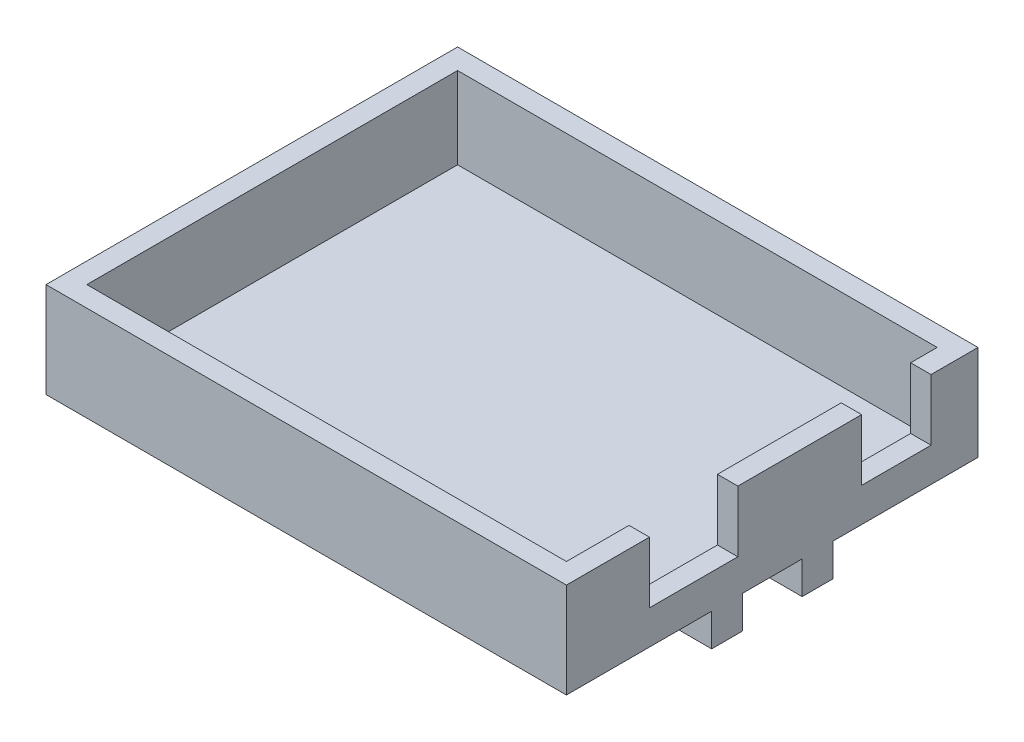
ISO-10303-21;
HEADER;
FILE_DESCRIPTION(('STEP AP214'),'2;1');
FILE_NAME('part.step','',(''),(''),'','','');
FILE_SCHEMA(('AUTOMOTIVE_DESIGN { 1 0 10303 214 1 1 1 1 }'));
ENDSEC;
DATA;
#1=APPLICATION_CONTEXT('core data for automotive mechanical design processes');
#2=APPLICATION_PROTOCOL_DEFINITION('international standard','automotive_design',2000,#1);
#3=PRODUCT_CONTEXT('',#1,'mechanical');
#4=PRODUCT('Part','Part','',(#3));
#5=PRODUCT_RELATED_PRODUCT_CATEGORY('part','',(#4));
#6=PRODUCT_DEFINITION_FORMATION('','',#4);
#7=PRODUCT_DEFINITION_CONTEXT('part definition',#1,'design');
#8=PRODUCT_DEFINITION('design','',#6,#7);
#9=PRODUCT_DEFINITION_SHAPE('','',#8);
#10=(LENGTH_UNIT() NAMED_UNIT(*) SI_UNIT(.MILLI.,.METRE.));
#11=(NAMED_UNIT(*) PLANE_ANGLE_UNIT() SI_UNIT($,.RADIAN.));
#12=(NAMED_UNIT(*) SI_UNIT($,.STERADIAN.) SOLID_ANGLE_UNIT());
#13=UNCERTAINTY_MEASURE_WITH_UNIT(LENGTH_MEASURE(1.E-05),#10,'distance_accuracy_value','');
#14=(GEOMETRIC_REPRESENTATION_CONTEXT(3) GLOBAL_UNCERTAINTY_ASSIGNED_CONTEXT((#13)) GLOBAL_UNIT_ASSIGNED_CONTEXT((#10,
#11,#12)) REPRESENTATION_CONTEXT('',''));
#15=CARTESIAN_POINT('',(0.,0.,0.));
#16=DIRECTION('',(0.,0.,1.));
#17=DIRECTION('',(1.,0.,0.));
#18=AXIS2_PLACEMENT_3D('',#15,#16,#17);
#19=CARTESIAN_POINT('',(0.,0.,0.));
#20=DIRECTION('',(0.,-1.,0.));
#21=DIRECTION('',(0.,0.,-1.));
#22=AXIS2_PLACEMENT_3D('',#19,#20,#21);
#23=PLANE('',#22);
#24=DIRECTION('',(-1.,0.,0.));
#25=VECTOR('',#24,1.);
#26=CARTESIAN_POINT('',(-38.25,0.,-8.9));
#27=LINE('',#26,#25);
#28=CARTESIAN_POINT('',(38.25,0.,-8.90000000000001));
#29=VERTEX_POINT('',#28);
#30=CARTESIAN_POINT('',(-38.25,0.,-8.90000000000001));
#31=VERTEX_POINT('',#30);
#32=EDGE_CURVE('E231',#29,#31,#27,.T.);
#33=ORIENTED_EDGE('',*,*,#32,.T.);
#34=DIRECTION('',(0.,0.,1.));
#35=VECTOR('',#34,1.);
#36=CARTESIAN_POINT('',(-38.25,0.,30.25));
#37=LINE('',#36,#35);
#38=CARTESIAN_POINT('',(-38.25,0.,-30.25));
#39=VERTEX_POINT('',#38);
#40=EDGE_CURVE('E208',#39,#31,#37,.T.);
#41=ORIENTED_EDGE('',*,*,#40,.F.);
#42=DIRECTION('',(-1.,0.,0.));
#43=VECTOR('',#42,1.);
#44=CARTESIAN_POINT('',(-38.25,0.,-30.25));
#45=LINE('',#44,#43);
#46=CARTESIAN_POINT('',(38.25,0.,-30.25));
#47=VERTEX_POINT('',#46);
#48=EDGE_CURVE('E363',#47,#39,#45,.T.);
#49=ORIENTED_EDGE('',*,*,#48,.F.);
#50=DIRECTION('',(0.,0.,-1.));
#51=VECTOR('',#50,1.);
#52=CARTESIAN_POINT('',(38.25,0.,30.25));
#53=LINE('',#52,#51);
#54=EDGE_CURVE('E53',#29,#47,#53,.T.);
#55=ORIENTED_EDGE('',*,*,#54,.F.);
#56=EDGE_LOOP('',(#33,#41,#49,#55));
#57=FACE_BOUND('',#56,.T.);
#58=ADVANCED_FACE('F38',(#57),#23,.T.);
#59=DIRECTION('',(-1.,0.,0.));
#60=VECTOR('',#59,1.);
#61=CARTESIAN_POINT('',(-38.25,0.,8.9));
#62=LINE('',#61,#60);
#63=CARTESIAN_POINT('',(38.25,0.,8.9));
#64=VERTEX_POINT('',#63);
#65=CARTESIAN_POINT('',(-38.25,0.,8.9));
#66=VERTEX_POINT('',#65);
#67=EDGE_CURVE('E243',#64,#66,#62,.T.);
#68=ORIENTED_EDGE('',*,*,#67,.F.);
#69=CARTESIAN_POINT('',(38.25,0.,30.25));
#70=VERTEX_POINT('',#69);
#71=EDGE_CURVE('E360',#70,#64,#53,.T.);
#72=ORIENTED_EDGE('',*,*,#71,.F.);
#73=DIRECTION('',(1.,0.,0.));
#74=VECTOR('',#73,1.);
#75=CARTESIAN_POINT('',(-38.25,0.,30.25));
#76=LINE('',#75,#74);
#77=CARTESIAN_POINT('',(-38.25,0.,30.25));
#78=VERTEX_POINT('',#77);
#79=EDGE_CURVE('E368',#78,#70,#76,.T.);
#80=ORIENTED_EDGE('',*,*,#79,.F.);
#81=EDGE_CURVE('E366',#66,#78,#37,.T.);
#82=ORIENTED_EDGE('',*,*,#81,.F.);
#83=EDGE_LOOP('',(#68,#72,#80,#82));
#84=FACE_BOUND('',#83,.T.);
#85=ADVANCED_FACE('F405',(#84),#23,.T.);
#86=CARTESIAN_POINT('',(0.,14.,0.));
#87=DIRECTION('',(0.,-1.,0.));
#88=DIRECTION('',(0.,0.,-1.));
#89=AXIS2_PLACEMENT_3D('',#86,#87,#88);
#90=PLANE('',#89);
#91=DIRECTION('',(0.,0.,-1.));
#92=VECTOR('',#91,1.);
#93=CARTESIAN_POINT('',(35.25,14.,-27.25));
#94=LINE('',#93,#92);
#95=CARTESIAN_POINT('',(35.25,14.,5.05));
#96=VERTEX_POINT('',#95);
#97=CARTESIAN_POINT('',(35.25,14.,-13.15));
#98=VERTEX_POINT('',#97);
#99=EDGE_CURVE('E332',#96,#98,#94,.T.);
#100=ORIENTED_EDGE('',*,*,#99,.F.);
#101=DIRECTION('',(1.,0.,0.));
#102=VECTOR('',#101,1.);
#103=CARTESIAN_POINT('',(-38.251,14.,5.05));
#104=LINE('',#103,#102);
#105=CARTESIAN_POINT('',(38.25,14.,5.05));
#106=VERTEX_POINT('',#105);
#107=EDGE_CURVE('E281',#96,#106,#104,.T.);
#108=ORIENTED_EDGE('',*,*,#107,.T.);
#109=DIRECTION('',(0.,0.,-1.));
#110=VECTOR('',#109,1.);
#111=CARTESIAN_POINT('',(38.25,14.,30.25));
#112=LINE('',#111,#110);
#113=CARTESIAN_POINT('',(38.25,14.,-13.15));
#114=VERTEX_POINT('',#113);
#115=EDGE_CURVE('E352',#106,#114,#112,.T.);
#116=ORIENTED_EDGE('',*,*,#115,.T.);
#117=DIRECTION('',(1.,0.,0.));
#118=VECTOR('',#117,1.);
#119=CARTESIAN_POINT('',(-38.251,14.,-13.15));
#120=LINE('',#119,#118);
#121=EDGE_CURVE('E296',#98,#114,#120,.T.);
#122=ORIENTED_EDGE('',*,*,#121,.F.);
#123=EDGE_LOOP('',(#100,#108,#116,#122));
#124=FACE_BOUND('',#123,.T.);
#125=ADVANCED_FACE('F421',(#124),#90,.F.);
#126=CARTESIAN_POINT('',(38.25,14.,30.25));
#127=DIRECTION('',(-1.,0.,0.));
#128=DIRECTION('',(0.,0.,1.));
#129=AXIS2_PLACEMENT_3D('',#126,#127,#128);
#130=PLANE('',#129);
#131=ORIENTED_EDGE('',*,*,#115,.F.);
#132=DIRECTION('',(0.,1.,0.));
#133=VECTOR('',#132,1.);
#134=CARTESIAN_POINT('',(38.25,14.,5.05));
#135=LINE('',#134,#133);
#136=CARTESIAN_POINT('',(38.25,5.,5.05));
#137=VERTEX_POINT('',#136);
#138=EDGE_CURVE('E278',#137,#106,#135,.T.);
#139=ORIENTED_EDGE('',*,*,#138,.F.);
#140=DIRECTION('',(0.,0.,-1.));
#141=VECTOR('',#140,1.);
#142=CARTESIAN_POINT('',(38.25,5.,18.05));
#143=LINE('',#142,#141);
#144=CARTESIAN_POINT('',(38.25,5.,18.05));
#145=VERTEX_POINT('',#144);
#146=EDGE_CURVE('E275',#145,#137,#143,.T.);
#147=ORIENTED_EDGE('',*,*,#146,.F.);
#148=DIRECTION('',(0.,-1.,0.));
#149=VECTOR('',#148,1.);
#150=CARTESIAN_POINT('',(38.25,14.,18.05));
#151=LINE('',#150,#149);
#152=CARTESIAN_POINT('',(38.25,14.,18.05));
#153=VERTEX_POINT('',#152);
#154=EDGE_CURVE('E272',#153,#145,#151,.T.);
#155=ORIENTED_EDGE('',*,*,#154,.F.);
#156=CARTESIAN_POINT('',(38.25,14.,30.25));
#157=VERTEX_POINT('',#156);
#158=EDGE_CURVE('E348',#157,#153,#112,.T.);
#159=ORIENTED_EDGE('',*,*,#158,.F.);
#160=DIRECTION('',(0.,-1.,0.));
#161=VECTOR('',#160,1.);
#162=CARTESIAN_POINT('',(38.25,14.,30.25));
#163=LINE('',#162,#161);
#164=EDGE_CURVE('E359',#157,#70,#163,.T.);
#165=ORIENTED_EDGE('',*,*,#164,.T.);
#166=ORIENTED_EDGE('',*,*,#71,.T.);
#167=DIRECTION('',(0.,1.,0.));
#168=VECTOR('',#167,1.);
#169=CARTESIAN_POINT('',(38.25,-4.8,8.9));
#170=LINE('',#169,#168);
#171=CARTESIAN_POINT('',(38.25,-4.8,8.9));
#172=VERTEX_POINT('',#171);
#173=EDGE_CURVE('E256',#172,#64,#170,.T.);
#174=ORIENTED_EDGE('',*,*,#173,.F.);
#175=DIRECTION('',(0.,0.,1.));
#176=VECTOR('',#175,1.);
#177=CARTESIAN_POINT('',(38.25,-4.8,4.4));
#178=LINE('',#177,#176);
#179=CARTESIAN_POINT('',(38.25,-4.8,4.4));
#180=VERTEX_POINT('',#179);
#181=EDGE_CURVE('E245',#180,#172,#178,.T.);
#182=ORIENTED_EDGE('',*,*,#181,.F.);
#183=DIRECTION('',(0.,1.,0.));
#184=VECTOR('',#183,1.);
#185=CARTESIAN_POINT('',(38.25,-4.8,4.4));
#186=LINE('',#185,#184);
#187=CARTESIAN_POINT('',(38.25,0.,4.4));
#188=VERTEX_POINT('',#187);
#189=EDGE_CURVE('E259',#180,#188,#186,.T.);
#190=ORIENTED_EDGE('',*,*,#189,.T.);
#191=CARTESIAN_POINT('',(38.25,0.,-4.4));
#192=VERTEX_POINT('',#191);
#193=EDGE_CURVE('E364',#188,#192,#53,.T.);
#194=ORIENTED_EDGE('',*,*,#193,.T.);
#195=DIRECTION('',(0.,1.,0.));
#196=VECTOR('',#195,1.);
#197=CARTESIAN_POINT('',(38.25,-4.8,-4.4));
#198=LINE('',#197,#196);
#199=CARTESIAN_POINT('',(38.25,-4.8,-4.4));
#200=VERTEX_POINT('',#199);
#201=EDGE_CURVE('E235',#200,#192,#198,.T.);
#202=ORIENTED_EDGE('',*,*,#201,.F.);
#203=DIRECTION('',(0.,0.,-1.));
#204=VECTOR('',#203,1.);
#205=CARTESIAN_POINT('',(38.25,-4.8,-4.4));
#206=LINE('',#205,#204);
#207=CARTESIAN_POINT('',(38.25,-4.8,-8.9));
#208=VERTEX_POINT('',#207);
#209=EDGE_CURVE('E225',#200,#208,#206,.T.);
#210=ORIENTED_EDGE('',*,*,#209,.T.);
#211=DIRECTION('',(0.,1.,0.));
#212=VECTOR('',#211,1.);
#213=CARTESIAN_POINT('',(38.25,-4.8,-8.9));
#214=LINE('',#213,#212);
#215=EDGE_CURVE('E213',#208,#29,#214,.T.);
#216=ORIENTED_EDGE('',*,*,#215,.T.);
#217=ORIENTED_EDGE('',*,*,#54,.T.);
#218=DIRECTION('',(0.,-1.,0.));
#219=VECTOR('',#218,1.);
#220=CARTESIAN_POINT('',(38.25,14.,-30.25));
#221=LINE('',#220,#219);
#222=CARTESIAN_POINT('',(38.25,14.,-30.25));
#223=VERTEX_POINT('',#222);
#224=EDGE_CURVE('E11',#223,#47,#221,.T.);
#225=ORIENTED_EDGE('',*,*,#224,.F.);
#226=CARTESIAN_POINT('',(38.25,14.,-23.35));
#227=VERTEX_POINT('',#226);
#228=EDGE_CURVE('E353',#227,#223,#112,.T.);
#229=ORIENTED_EDGE('',*,*,#228,.F.);
#230=DIRECTION('',(0.,1.,0.));
#231=VECTOR('',#230,1.);
#232=CARTESIAN_POINT('',(38.25,14.,-23.35));
#233=LINE('',#232,#231);
#234=CARTESIAN_POINT('',(38.25,5.,-23.35));
#235=VERTEX_POINT('',#234);
#236=EDGE_CURVE('E306',#235,#227,#233,.T.);
#237=ORIENTED_EDGE('',*,*,#236,.F.);
#238=DIRECTION('',(0.,0.,-1.));
#239=VECTOR('',#238,1.);
#240=CARTESIAN_POINT('',(38.25,5.,-23.35));
#241=LINE('',#240,#239);
#242=CARTESIAN_POINT('',(38.25,5.,-13.15));
#243=VERTEX_POINT('',#242);
#244=EDGE_CURVE('E295',#243,#235,#241,.T.);
#245=ORIENTED_EDGE('',*,*,#244,.F.);
#246=DIRECTION('',(0.,-1.,0.));
#247=VECTOR('',#246,1.);
#248=CARTESIAN_POINT('',(38.25,14.,-13.15));
#249=LINE('',#248,#247);
#250=EDGE_CURVE('E303',#114,#243,#249,.T.);
#251=ORIENTED_EDGE('',*,*,#250,.F.);
#252=EDGE_LOOP('',(#131,#139,#147,#155,#159,#165,#166,#174,#182,#190,#194,#202,#210,#216,#217,
#225,#229,#237,#245,#251));
#253=FACE_BOUND('',#252,.T.);
#254=ADVANCED_FACE('F40',(#253),#130,.F.);
#255=CARTESIAN_POINT('',(-38.25,14.,-30.25));
#256=DIRECTION('',(0.,0.,1.));
#257=DIRECTION('',(1.,0.,0.));
#258=AXIS2_PLACEMENT_3D('',#255,#256,#257);
#259=PLANE('',#258);
#260=ORIENTED_EDGE('',*,*,#48,.T.);
#261=DIRECTION('',(0.,-1.,0.));
#262=VECTOR('',#261,1.);
#263=CARTESIAN_POINT('',(-38.25,14.,-30.25));
#264=LINE('',#263,#262);
#265=CARTESIAN_POINT('',(-38.25,14.,-30.25));
#266=VERTEX_POINT('',#265);
#267=EDGE_CURVE('E46',#266,#39,#264,.T.);
#268=ORIENTED_EDGE('',*,*,#267,.F.);
#269=DIRECTION('',(-1.,0.,0.));
#270=VECTOR('',#269,1.);
#271=CARTESIAN_POINT('',(-38.25,14.,-30.25));
#272=LINE('',#271,#270);
#273=EDGE_CURVE('E351',#223,#266,#272,.T.);
#274=ORIENTED_EDGE('',*,*,#273,.F.);
#275=ORIENTED_EDGE('',*,*,#224,.T.);
#276=EDGE_LOOP('',(#260,#268,#274,#275));
#277=FACE_BOUND('',#276,.T.);
#278=ADVANCED_FACE('F381',(#277),#259,.F.);
#279=CARTESIAN_POINT('',(-38.25,14.,30.25));
#280=DIRECTION('',(1.,0.,0.));
#281=DIRECTION('',(0.,0.,-1.));
#282=AXIS2_PLACEMENT_3D('',#279,#280,#281);
#283=PLANE('',#282);
#284=ORIENTED_EDGE('',*,*,#40,.T.);
#285=DIRECTION('',(0.,1.,0.));
#286=VECTOR('',#285,1.);
#287=CARTESIAN_POINT('',(-38.25,-4.8,-8.9));
#288=LINE('',#287,#286);
#289=CARTESIAN_POINT('',(-38.25,-4.8,-8.9));
#290=VERTEX_POINT('',#289);
#291=EDGE_CURVE('E200',#290,#31,#288,.T.);
#292=ORIENTED_EDGE('',*,*,#291,.F.);
#293=DIRECTION('',(0.,0.,1.));
#294=VECTOR('',#293,1.);
#295=CARTESIAN_POINT('',(-38.25,-4.8,-4.4));
#296=LINE('',#295,#294);
#297=CARTESIAN_POINT('',(-38.25,-4.8,-4.4));
#298=VERTEX_POINT('',#297);
#299=EDGE_CURVE('E204',#290,#298,#296,.T.);
#300=ORIENTED_EDGE('',*,*,#299,.T.);
#301=DIRECTION('',(0.,1.,0.));
#302=VECTOR('',#301,1.);
#303=CARTESIAN_POINT('',(-38.25,-4.8,-4.4));
#304=LINE('',#303,#302);
#305=CARTESIAN_POINT('',(-38.25,0.,-4.4));
#306=VERTEX_POINT('',#305);
#307=EDGE_CURVE('E230',#298,#306,#304,.T.);
#308=ORIENTED_EDGE('',*,*,#307,.T.);
#309=CARTESIAN_POINT('',(-38.25,0.,4.4));
#310=VERTEX_POINT('',#309);
#311=EDGE_CURVE('E369',#306,#310,#37,.T.);
#312=ORIENTED_EDGE('',*,*,#311,.T.);
#313=DIRECTION('',(0.,1.,0.));
#314=VECTOR('',#313,1.);
#315=CARTESIAN_POINT('',(-38.25,-4.8,4.4));
#316=LINE('',#315,#314);
#317=CARTESIAN_POINT('',(-38.25,-4.8,4.4));
#318=VERTEX_POINT('',#317);
#319=EDGE_CURVE('E262',#318,#310,#316,.T.);
#320=ORIENTED_EDGE('',*,*,#319,.F.);
#321=DIRECTION('',(0.,0.,-1.));
#322=VECTOR('',#321,1.);
#323=CARTESIAN_POINT('',(-38.25,-4.8,4.4));
#324=LINE('',#323,#322);
#325=CARTESIAN_POINT('',(-38.25,-4.8,8.9));
#326=VERTEX_POINT('',#325);
#327=EDGE_CURVE('E239',#326,#318,#324,.T.);
#328=ORIENTED_EDGE('',*,*,#327,.F.);
#329=DIRECTION('',(0.,1.,0.));
#330=VECTOR('',#329,1.);
#331=CARTESIAN_POINT('',(-38.25,-4.8,8.9));
#332=LINE('',#331,#330);
#333=EDGE_CURVE('E249',#326,#66,#332,.T.);
#334=ORIENTED_EDGE('',*,*,#333,.T.);
#335=ORIENTED_EDGE('',*,*,#81,.T.);
#336=DIRECTION('',(0.,-1.,0.));
#337=VECTOR('',#336,1.);
#338=CARTESIAN_POINT('',(-38.25,14.,30.25));
#339=LINE('',#338,#337);
#340=CARTESIAN_POINT('',(-38.25,14.,30.25));
#341=VERTEX_POINT('',#340);
#342=EDGE_CURVE('E373',#341,#78,#339,.T.);
#343=ORIENTED_EDGE('',*,*,#342,.F.);
#344=DIRECTION('',(0.,0.,1.));
#345=VECTOR('',#344,1.);
#346=CARTESIAN_POINT('',(-38.25,14.,30.25));
#347=LINE('',#346,#345);
#348=EDGE_CURVE('E355',#266,#341,#347,.T.);
#349=ORIENTED_EDGE('',*,*,#348,.F.);
#350=ORIENTED_EDGE('',*,*,#267,.T.);
#351=EDGE_LOOP('',(#284,#292,#300,#308,#312,#320,#328,#334,#335,#343,#349,#350));
#352=FACE_BOUND('',#351,.T.);
#353=ADVANCED_FACE('F202',(#352),#283,.F.);
#354=CARTESIAN_POINT('',(-38.25,14.,30.25));
#355=DIRECTION('',(0.,0.,-1.));
#356=DIRECTION('',(-1.,0.,0.));
#357=AXIS2_PLACEMENT_3D('',#354,#355,#356);
#358=PLANE('',#357);
#359=ORIENTED_EDGE('',*,*,#79,.T.);
#360=ORIENTED_EDGE('',*,*,#164,.F.);
#361=DIRECTION('',(1.,0.,0.));
#362=VECTOR('',#361,1.);
#363=CARTESIAN_POINT('',(-38.25,14.,30.25));
#364=LINE('',#363,#362);
#365=EDGE_CURVE('E357',#341,#157,#364,.T.);
#366=ORIENTED_EDGE('',*,*,#365,.F.);
#367=ORIENTED_EDGE('',*,*,#342,.T.);
#368=EDGE_LOOP('',(#359,#360,#366,#367));
#369=FACE_BOUND('',#368,.T.);
#370=ADVANCED_FACE('F412',(#369),#358,.F.);
#371=ORIENTED_EDGE('',*,*,#158,.T.);
#372=DIRECTION('',(1.,0.,0.));
#373=VECTOR('',#372,1.);
#374=CARTESIAN_POINT('',(-38.251,14.,18.05));
#375=LINE('',#374,#373);
#376=CARTESIAN_POINT('',(35.25,14.,18.05));
#377=VERTEX_POINT('',#376);
#378=EDGE_CURVE('E280',#377,#153,#375,.T.);
#379=ORIENTED_EDGE('',*,*,#378,.F.);
#380=CARTESIAN_POINT('',(35.25,14.,27.25));
#381=VERTEX_POINT('',#380);
#382=EDGE_CURVE('E328',#381,#377,#94,.T.);
#383=ORIENTED_EDGE('',*,*,#382,.F.);
#384=DIRECTION('',(1.,0.,0.));
#385=VECTOR('',#384,1.);
#386=CARTESIAN_POINT('',(-35.25,14.,27.25));
#387=LINE('',#386,#385);
#388=CARTESIAN_POINT('',(-35.25,14.,27.25));
#389=VERTEX_POINT('',#388);
#390=EDGE_CURVE('E318',#389,#381,#387,.T.);
#391=ORIENTED_EDGE('',*,*,#390,.F.);
#392=DIRECTION('',(0.,0.,1.));
#393=VECTOR('',#392,1.);
#394=CARTESIAN_POINT('',(-35.25,14.,-27.25));
#395=LINE('',#394,#393);
#396=CARTESIAN_POINT('',(-35.25,14.,-27.25));
#397=VERTEX_POINT('',#396);
#398=EDGE_CURVE('E335',#397,#389,#395,.T.);
#399=ORIENTED_EDGE('',*,*,#398,.F.);
#400=DIRECTION('',(-1.,0.,0.));
#401=VECTOR('',#400,1.);
#402=CARTESIAN_POINT('',(-35.25,14.,-27.25));
#403=LINE('',#402,#401);
#404=CARTESIAN_POINT('',(35.25,14.,-27.25));
#405=VERTEX_POINT('',#404);
#406=EDGE_CURVE('E331',#405,#397,#403,.T.);
#407=ORIENTED_EDGE('',*,*,#406,.F.);
#408=CARTESIAN_POINT('',(35.25,14.,-23.35));
#409=VERTEX_POINT('',#408);
#410=EDGE_CURVE('E291',#409,#405,#94,.T.);
#411=ORIENTED_EDGE('',*,*,#410,.F.);
#412=DIRECTION('',(1.,0.,0.));
#413=VECTOR('',#412,1.);
#414=CARTESIAN_POINT('',(-38.251,14.,-23.35));
#415=LINE('',#414,#413);
#416=EDGE_CURVE('E292',#409,#227,#415,.T.);
#417=ORIENTED_EDGE('',*,*,#416,.T.);
#418=ORIENTED_EDGE('',*,*,#228,.T.);
#419=ORIENTED_EDGE('',*,*,#273,.T.);
#420=ORIENTED_EDGE('',*,*,#348,.T.);
#421=ORIENTED_EDGE('',*,*,#365,.T.);
#422=EDGE_LOOP('',(#371,#379,#383,#391,#399,#407,#411,#417,#418,#419,#420,#421));
#423=FACE_BOUND('',#422,.T.);
#424=ADVANCED_FACE('F414',(#423),#90,.F.);
#425=DIRECTION('',(1.,0.,0.));
#426=VECTOR('',#425,1.);
#427=CARTESIAN_POINT('',(-38.25,0.,-4.4));
#428=LINE('',#427,#426);
#429=EDGE_CURVE('E61',#306,#192,#428,.T.);
#430=ORIENTED_EDGE('',*,*,#429,.T.);
#431=ORIENTED_EDGE('',*,*,#193,.F.);
#432=DIRECTION('',(1.,0.,0.));
#433=VECTOR('',#432,1.);
#434=CARTESIAN_POINT('',(-38.25,0.,4.4));
#435=LINE('',#434,#433);
#436=EDGE_CURVE('E212',#310,#188,#435,.T.);
#437=ORIENTED_EDGE('',*,*,#436,.F.);
#438=ORIENTED_EDGE('',*,*,#311,.F.);
#439=EDGE_LOOP('',(#430,#431,#437,#438));
#440=FACE_BOUND('',#439,.T.);
#441=ADVANCED_FACE('F393',(#440),#23,.T.);
#442=CARTESIAN_POINT('',(35.25,2.,-27.25));
#443=DIRECTION('',(1.,0.,0.));
#444=DIRECTION('',(0.,0.,-1.));
#445=AXIS2_PLACEMENT_3D('',#442,#443,#444);
#446=PLANE('',#445);
#447=DIRECTION('',(0.,0.,1.));
#448=VECTOR('',#447,1.);
#449=CARTESIAN_POINT('',(35.25,5.,18.05));
#450=LINE('',#449,#448);
#451=CARTESIAN_POINT('',(35.25,5.,5.05));
#452=VERTEX_POINT('',#451);
#453=CARTESIAN_POINT('',(35.25,5.,18.05));
#454=VERTEX_POINT('',#453);
#455=EDGE_CURVE('E266',#452,#454,#450,.T.);
#456=ORIENTED_EDGE('',*,*,#455,.F.);
#457=DIRECTION('',(0.,-1.,0.));
#458=VECTOR('',#457,1.);
#459=CARTESIAN_POINT('',(35.25,14.,5.05));
#460=LINE('',#459,#458);
#461=EDGE_CURVE('E268',#96,#452,#460,.T.);
#462=ORIENTED_EDGE('',*,*,#461,.F.);
#463=ORIENTED_EDGE('',*,*,#99,.T.);
#464=DIRECTION('',(0.,1.,0.));
#465=VECTOR('',#464,1.);
#466=CARTESIAN_POINT('',(35.25,14.,-13.15));
#467=LINE('',#466,#465);
#468=CARTESIAN_POINT('',(35.25,5.,-13.15));
#469=VERTEX_POINT('',#468);
#470=EDGE_CURVE('E269',#469,#98,#467,.T.);
#471=ORIENTED_EDGE('',*,*,#470,.F.);
#472=DIRECTION('',(0.,0.,1.));
#473=VECTOR('',#472,1.);
#474=CARTESIAN_POINT('',(35.25,5.,-23.35));
#475=LINE('',#474,#473);
#476=CARTESIAN_POINT('',(35.25,5.,-23.35));
#477=VERTEX_POINT('',#476);
#478=EDGE_CURVE('E311',#477,#469,#475,.T.);
#479=ORIENTED_EDGE('',*,*,#478,.F.);
#480=DIRECTION('',(0.,-1.,0.));
#481=VECTOR('',#480,1.);
#482=CARTESIAN_POINT('',(35.25,14.,-23.35));
#483=LINE('',#482,#481);
#484=EDGE_CURVE('E308',#409,#477,#483,.T.);
#485=ORIENTED_EDGE('',*,*,#484,.F.);
#486=ORIENTED_EDGE('',*,*,#410,.T.);
#487=DIRECTION('',(0.,1.,0.));
#488=VECTOR('',#487,1.);
#489=CARTESIAN_POINT('',(35.25,2.,-27.25));
#490=LINE('',#489,#488);
#491=CARTESIAN_POINT('',(35.25,2.,-27.25));
#492=VERTEX_POINT('',#491);
#493=EDGE_CURVE('E327',#492,#405,#490,.T.);
#494=ORIENTED_EDGE('',*,*,#493,.F.);
#495=DIRECTION('',(0.,0.,-1.));
#496=VECTOR('',#495,1.);
#497=CARTESIAN_POINT('',(35.25,2.,-27.25));
#498=LINE('',#497,#496);
#499=CARTESIAN_POINT('',(35.25,2.,27.25));
#500=VERTEX_POINT('',#499);
#501=EDGE_CURVE('E314',#500,#492,#498,.T.);
#502=ORIENTED_EDGE('',*,*,#501,.F.);
#503=DIRECTION('',(0.,1.,0.));
#504=VECTOR('',#503,1.);
#505=CARTESIAN_POINT('',(35.25,2.,27.25));
#506=LINE('',#505,#504);
#507=EDGE_CURVE('E340',#500,#381,#506,.T.);
#508=ORIENTED_EDGE('',*,*,#507,.T.);
#509=ORIENTED_EDGE('',*,*,#382,.T.);
#510=DIRECTION('',(0.,1.,0.));
#511=VECTOR('',#510,1.);
#512=CARTESIAN_POINT('',(35.25,14.,18.05));
#513=LINE('',#512,#511);
#514=EDGE_CURVE('E284',#454,#377,#513,.T.);
#515=ORIENTED_EDGE('',*,*,#514,.F.);
#516=EDGE_LOOP('',(#456,#462,#463,#471,#479,#485,#486,#494,#502,#508,#509,#515));
#517=FACE_BOUND('',#516,.T.);
#518=ADVANCED_FACE('F434',(#517),#446,.F.);
#519=CARTESIAN_POINT('',(-35.25,2.,27.25));
#520=DIRECTION('',(0.,0.,1.));
#521=DIRECTION('',(1.,0.,0.));
#522=AXIS2_PLACEMENT_3D('',#519,#520,#521);
#523=PLANE('',#522);
#524=ORIENTED_EDGE('',*,*,#390,.T.);
#525=ORIENTED_EDGE('',*,*,#507,.F.);
#526=DIRECTION('',(1.,0.,0.));
#527=VECTOR('',#526,1.);
#528=CARTESIAN_POINT('',(-35.25,2.,27.25));
#529=LINE('',#528,#527);
#530=CARTESIAN_POINT('',(-35.25,2.,27.25));
#531=VERTEX_POINT('',#530);
#532=EDGE_CURVE('E324',#531,#500,#529,.T.);
#533=ORIENTED_EDGE('',*,*,#532,.F.);
#534=DIRECTION('',(0.,1.,0.));
#535=VECTOR('',#534,1.);
#536=CARTESIAN_POINT('',(-35.25,2.,27.25));
#537=LINE('',#536,#535);
#538=EDGE_CURVE('E342',#531,#389,#537,.T.);
#539=ORIENTED_EDGE('',*,*,#538,.T.);
#540=EDGE_LOOP('',(#524,#525,#533,#539));
#541=FACE_BOUND('',#540,.T.);
#542=ADVANCED_FACE('F453',(#541),#523,.F.);
#543=CARTESIAN_POINT('',(-35.25,2.,-27.25));
#544=DIRECTION('',(-1.,0.,0.));
#545=DIRECTION('',(0.,0.,1.));
#546=AXIS2_PLACEMENT_3D('',#543,#544,#545);
#547=PLANE('',#546);
#548=ORIENTED_EDGE('',*,*,#398,.T.);
#549=ORIENTED_EDGE('',*,*,#538,.F.);
#550=DIRECTION('',(0.,0.,1.));
#551=VECTOR('',#550,1.);
#552=CARTESIAN_POINT('',(-35.25,2.,-27.25));
#553=LINE('',#552,#551);
#554=CARTESIAN_POINT('',(-35.25,2.,-27.25));
#555=VERTEX_POINT('',#554);
#556=EDGE_CURVE('E321',#555,#531,#553,.T.);
#557=ORIENTED_EDGE('',*,*,#556,.F.);
#558=DIRECTION('',(0.,1.,0.));
#559=VECTOR('',#558,1.);
#560=CARTESIAN_POINT('',(-35.25,2.,-27.25));
#561=LINE('',#560,#559);
#562=EDGE_CURVE('E344',#555,#397,#561,.T.);
#563=ORIENTED_EDGE('',*,*,#562,.T.);
#564=EDGE_LOOP('',(#548,#549,#557,#563));
#565=FACE_BOUND('',#564,.T.);
#566=ADVANCED_FACE('F446',(#565),#547,.F.);
#567=CARTESIAN_POINT('',(-35.25,2.,-27.25));
#568=DIRECTION('',(0.,0.,-1.));
#569=DIRECTION('',(-1.,0.,0.));
#570=AXIS2_PLACEMENT_3D('',#567,#568,#569);
#571=PLANE('',#570);
#572=ORIENTED_EDGE('',*,*,#406,.T.);
#573=ORIENTED_EDGE('',*,*,#562,.F.);
#574=DIRECTION('',(-1.,0.,0.));
#575=VECTOR('',#574,1.);
#576=CARTESIAN_POINT('',(-35.25,2.,-27.25));
#577=LINE('',#576,#575);
#578=EDGE_CURVE('E317',#492,#555,#577,.T.);
#579=ORIENTED_EDGE('',*,*,#578,.F.);
#580=ORIENTED_EDGE('',*,*,#493,.T.);
#581=EDGE_LOOP('',(#572,#573,#579,#580));
#582=FACE_BOUND('',#581,.T.);
#583=ADVANCED_FACE('F441',(#582),#571,.F.);
#584=CARTESIAN_POINT('',(0.,2.,0.));
#585=DIRECTION('',(0.,1.,0.));
#586=DIRECTION('',(0.,0.,1.));
#587=AXIS2_PLACEMENT_3D('',#584,#585,#586);
#588=PLANE('',#587);
#589=ORIENTED_EDGE('',*,*,#501,.T.);
#590=ORIENTED_EDGE('',*,*,#578,.T.);
#591=ORIENTED_EDGE('',*,*,#556,.T.);
#592=ORIENTED_EDGE('',*,*,#532,.T.);
#593=EDGE_LOOP('',(#589,#590,#591,#592));
#594=FACE_BOUND('',#593,.T.);
#595=ADVANCED_FACE('F450',(#594),#588,.T.);
#596=CARTESIAN_POINT('',(-38.251,14.,-23.35));
#597=DIRECTION('',(0.,0.,-1.));
#598=DIRECTION('',(-1.,0.,0.));
#599=AXIS2_PLACEMENT_3D('',#596,#597,#598);
#600=PLANE('',#599);
#601=ORIENTED_EDGE('',*,*,#484,.T.);
#602=DIRECTION('',(1.,0.,0.));
#603=VECTOR('',#602,1.);
#604=CARTESIAN_POINT('',(-38.251,5.,-23.35));
#605=LINE('',#604,#603);
#606=EDGE_CURVE('E265',#477,#235,#605,.T.);
#607=ORIENTED_EDGE('',*,*,#606,.T.);
#608=ORIENTED_EDGE('',*,*,#236,.T.);
#609=ORIENTED_EDGE('',*,*,#416,.F.);
#610=EDGE_LOOP('',(#601,#607,#608,#609));
#611=FACE_BOUND('',#610,.T.);
#612=ADVANCED_FACE('F545',(#611),#600,.F.);
#613=CARTESIAN_POINT('',(-38.251,5.,-23.35));
#614=DIRECTION('',(0.,-1.,0.));
#615=DIRECTION('',(0.,0.,-1.));
#616=AXIS2_PLACEMENT_3D('',#613,#614,#615);
#617=PLANE('',#616);
#618=ORIENTED_EDGE('',*,*,#478,.T.);
#619=DIRECTION('',(1.,0.,0.));
#620=VECTOR('',#619,1.);
#621=CARTESIAN_POINT('',(-38.251,5.,-13.15));
#622=LINE('',#621,#620);
#623=EDGE_CURVE('E298',#469,#243,#622,.T.);
#624=ORIENTED_EDGE('',*,*,#623,.T.);
#625=ORIENTED_EDGE('',*,*,#244,.T.);
#626=ORIENTED_EDGE('',*,*,#606,.F.);
#627=EDGE_LOOP('',(#618,#624,#625,#626));
#628=FACE_BOUND('',#627,.T.);
#629=ADVANCED_FACE('F468',(#628),#617,.F.);
#630=CARTESIAN_POINT('',(-38.251,14.,-13.15));
#631=DIRECTION('',(0.,0.,1.));
#632=DIRECTION('',(0.,-1.,0.));
#633=AXIS2_PLACEMENT_3D('',#630,#631,#632);
#634=PLANE('',#633);
#635=ORIENTED_EDGE('',*,*,#470,.T.);
#636=ORIENTED_EDGE('',*,*,#121,.T.);
#637=ORIENTED_EDGE('',*,*,#250,.T.);
#638=ORIENTED_EDGE('',*,*,#623,.F.);
#639=EDGE_LOOP('',(#635,#636,#637,#638));
#640=FACE_BOUND('',#639,.T.);
#641=ADVANCED_FACE('F429',(#640),#634,.F.);
#642=CARTESIAN_POINT('',(-38.251,14.,5.05));
#643=DIRECTION('',(0.,0.,-1.));
#644=DIRECTION('',(0.,1.,0.));
#645=AXIS2_PLACEMENT_3D('',#642,#643,#644);
#646=PLANE('',#645);
#647=ORIENTED_EDGE('',*,*,#461,.T.);
#648=DIRECTION('',(1.,0.,0.));
#649=VECTOR('',#648,1.);
#650=CARTESIAN_POINT('',(-38.251,5.,5.05));
#651=LINE('',#650,#649);
#652=EDGE_CURVE('E285',#452,#137,#651,.T.);
#653=ORIENTED_EDGE('',*,*,#652,.T.);
#654=ORIENTED_EDGE('',*,*,#138,.T.);
#655=ORIENTED_EDGE('',*,*,#107,.F.);
#656=EDGE_LOOP('',(#647,#653,#654,#655));
#657=FACE_BOUND('',#656,.T.);
#658=ADVANCED_FACE('F460',(#657),#646,.F.);
#659=CARTESIAN_POINT('',(-38.251,5.,18.05));
#660=DIRECTION('',(0.,-1.,0.));
#661=DIRECTION('',(0.,0.,-1.));
#662=AXIS2_PLACEMENT_3D('',#659,#660,#661);
#663=PLANE('',#662);
#664=ORIENTED_EDGE('',*,*,#455,.T.);
#665=DIRECTION('',(1.,0.,0.));
#666=VECTOR('',#665,1.);
#667=CARTESIAN_POINT('',(-38.251,5.,18.05));
#668=LINE('',#667,#666);
#669=EDGE_CURVE('E287',#454,#145,#668,.T.);
#670=ORIENTED_EDGE('',*,*,#669,.T.);
#671=ORIENTED_EDGE('',*,*,#146,.T.);
#672=ORIENTED_EDGE('',*,*,#652,.F.);
#673=EDGE_LOOP('',(#664,#670,#671,#672));
#674=FACE_BOUND('',#673,.T.);
#675=ADVANCED_FACE('F458',(#674),#663,.F.);
#676=CARTESIAN_POINT('',(-38.251,14.,18.05));
#677=DIRECTION('',(0.,0.,1.));
#678=DIRECTION('',(1.,0.,0.));
#679=AXIS2_PLACEMENT_3D('',#676,#677,#678);
#680=PLANE('',#679);
#681=ORIENTED_EDGE('',*,*,#514,.T.);
#682=ORIENTED_EDGE('',*,*,#378,.T.);
#683=ORIENTED_EDGE('',*,*,#154,.T.);
#684=ORIENTED_EDGE('',*,*,#669,.F.);
#685=EDGE_LOOP('',(#681,#682,#683,#684));
#686=FACE_BOUND('',#685,.T.);
#687=ADVANCED_FACE('F455',(#686),#680,.F.);
#688=CARTESIAN_POINT('',(-38.25,-4.8,4.4));
#689=DIRECTION('',(0.,0.,1.));
#690=DIRECTION('',(1.,0.,0.));
#691=AXIS2_PLACEMENT_3D('',#688,#689,#690);
#692=PLANE('',#691);
#693=ORIENTED_EDGE('',*,*,#436,.T.);
#694=ORIENTED_EDGE('',*,*,#189,.F.);
#695=DIRECTION('',(1.,0.,0.));
#696=VECTOR('',#695,1.);
#697=CARTESIAN_POINT('',(-38.25,-4.8,4.4));
#698=LINE('',#697,#696);
#699=EDGE_CURVE('E242',#318,#180,#698,.T.);
#700=ORIENTED_EDGE('',*,*,#699,.F.);
#701=ORIENTED_EDGE('',*,*,#319,.T.);
#702=EDGE_LOOP('',(#693,#694,#700,#701));
#703=FACE_BOUND('',#702,.T.);
#704=ADVANCED_FACE('F395',(#703),#692,.F.);
#705=CARTESIAN_POINT('',(-38.25,-4.8,8.9));
#706=DIRECTION('',(0.,0.,-1.));
#707=DIRECTION('',(-1.,0.,0.));
#708=AXIS2_PLACEMENT_3D('',#705,#706,#707);
#709=PLANE('',#708);
#710=ORIENTED_EDGE('',*,*,#67,.T.);
#711=ORIENTED_EDGE('',*,*,#333,.F.);
#712=DIRECTION('',(-1.,0.,0.));
#713=VECTOR('',#712,1.);
#714=CARTESIAN_POINT('',(-38.25,-4.8,8.9));
#715=LINE('',#714,#713);
#716=EDGE_CURVE('E247',#172,#326,#715,.T.);
#717=ORIENTED_EDGE('',*,*,#716,.F.);
#718=ORIENTED_EDGE('',*,*,#173,.T.);
#719=EDGE_LOOP('',(#710,#711,#717,#718));
#720=FACE_BOUND('',#719,.T.);
#721=ADVANCED_FACE('F401',(#720),#709,.F.);
#722=CARTESIAN_POINT('',(0.,-4.8,0.));
#723=DIRECTION('',(0.,1.,0.));
#724=DIRECTION('',(0.,0.,1.));
#725=AXIS2_PLACEMENT_3D('',#722,#723,#724);
#726=PLANE('',#725);
#727=ORIENTED_EDGE('',*,*,#327,.T.);
#728=ORIENTED_EDGE('',*,*,#699,.T.);
#729=ORIENTED_EDGE('',*,*,#181,.T.);
#730=ORIENTED_EDGE('',*,*,#716,.T.);
#731=EDGE_LOOP('',(#727,#728,#729,#730));
#732=FACE_BOUND('',#731,.T.);
#733=ADVANCED_FACE('F397',(#732),#726,.F.);
#734=CARTESIAN_POINT('',(-38.25,-4.8,-8.9));
#735=DIRECTION('',(0.,0.,-1.));
#736=DIRECTION('',(-1.,0.,0.));
#737=AXIS2_PLACEMENT_3D('',#734,#735,#736);
#738=PLANE('',#737);
#739=ORIENTED_EDGE('',*,*,#32,.F.);
#740=ORIENTED_EDGE('',*,*,#215,.F.);
#741=DIRECTION('',(-1.,0.,0.));
#742=VECTOR('',#741,1.);
#743=CARTESIAN_POINT('',(-38.25,-4.8,-8.9));
#744=LINE('',#743,#742);
#745=EDGE_CURVE('E219',#208,#290,#744,.T.);
#746=ORIENTED_EDGE('',*,*,#745,.T.);
#747=ORIENTED_EDGE('',*,*,#291,.T.);
#748=EDGE_LOOP('',(#739,#740,#746,#747));
#749=FACE_BOUND('',#748,.T.);
#750=ADVANCED_FACE('F224',(#749),#738,.T.);
#751=CARTESIAN_POINT('',(-38.25,-4.8,-4.4));
#752=DIRECTION('',(0.,0.,1.));
#753=DIRECTION('',(1.,0.,0.));
#754=AXIS2_PLACEMENT_3D('',#751,#752,#753);
#755=PLANE('',#754);
#756=ORIENTED_EDGE('',*,*,#429,.F.);
#757=ORIENTED_EDGE('',*,*,#307,.F.);
#758=DIRECTION('',(1.,0.,0.));
#759=VECTOR('',#758,1.);
#760=CARTESIAN_POINT('',(-38.25,-4.8,-4.4));
#761=LINE('',#760,#759);
#762=EDGE_CURVE('E222',#298,#200,#761,.T.);
#763=ORIENTED_EDGE('',*,*,#762,.T.);
#764=ORIENTED_EDGE('',*,*,#201,.T.);
#765=EDGE_LOOP('',(#756,#757,#763,#764));
#766=FACE_BOUND('',#765,.T.);
#767=ADVANCED_FACE('F390',(#766),#755,.T.);
#768=CARTESIAN_POINT('',(0.,-4.8,0.));
#769=DIRECTION('',(0.,1.,0.));
#770=DIRECTION('',(0.,0.,-1.));
#771=AXIS2_PLACEMENT_3D('',#768,#769,#770);
#772=PLANE('',#771);
#773=ORIENTED_EDGE('',*,*,#299,.F.);
#774=ORIENTED_EDGE('',*,*,#745,.F.);
#775=ORIENTED_EDGE('',*,*,#209,.F.);
#776=ORIENTED_EDGE('',*,*,#762,.F.);
#777=EDGE_LOOP('',(#773,#774,#775,#776));
#778=FACE_BOUND('',#777,.T.);
#779=ADVANCED_FACE('F217',(#778),#772,.F.);
#780=CLOSED_SHELL('',(#58,#85,#125,#254,#278,#353,#370,#424,#441,#518,#542,#566,#583,#595,#612,
#629,#641,#658,#675,#687,#704,#721,#733,#750,#767,#779));
#781=MANIFOLD_SOLID_BREP('B2',#780);
#782=ADVANCED_BREP_SHAPE_REPRESENTATION('',(#18,#781),#14);
#783=SHAPE_DEFINITION_REPRESENTATION(#9,#782);
ENDSEC;
END-ISO-10303-21;
